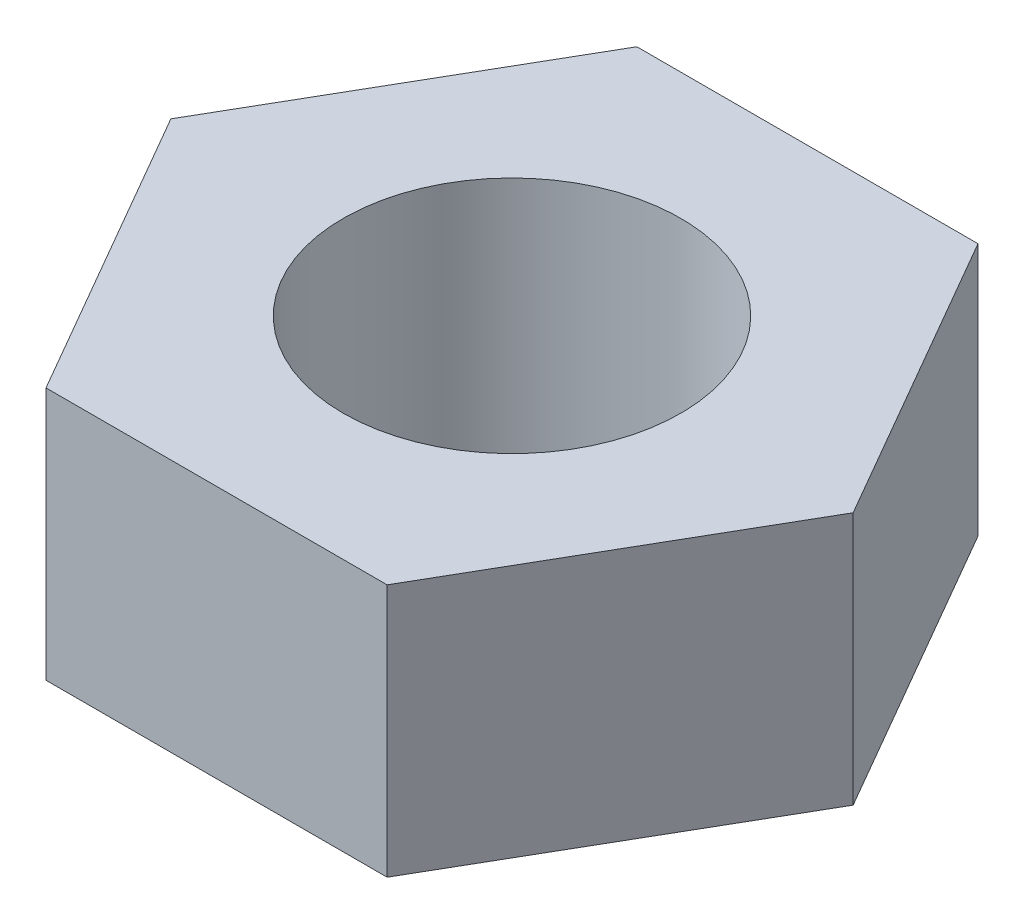
ISO-10303-21;
HEADER;
FILE_DESCRIPTION(('STEP AP214'),'2;1');
FILE_NAME('part.step','',(''),(''),'','','');
FILE_SCHEMA(('AUTOMOTIVE_DESIGN { 1 0 10303 214 1 1 1 1 }'));
ENDSEC;
DATA;
#1=APPLICATION_CONTEXT('core data for automotive mechanical design processes');
#2=APPLICATION_PROTOCOL_DEFINITION('international standard','automotive_design',2000,#1);
#3=PRODUCT_CONTEXT('',#1,'mechanical');
#4=PRODUCT('Part','Part','',(#3));
#5=PRODUCT_RELATED_PRODUCT_CATEGORY('part','',(#4));
#6=PRODUCT_DEFINITION_FORMATION('','',#4);
#7=PRODUCT_DEFINITION_CONTEXT('part definition',#1,'design');
#8=PRODUCT_DEFINITION('design','',#6,#7);
#9=PRODUCT_DEFINITION_SHAPE('','',#8);
#10=(LENGTH_UNIT() NAMED_UNIT(*) SI_UNIT(.MILLI.,.METRE.));
#11=(NAMED_UNIT(*) PLANE_ANGLE_UNIT() SI_UNIT($,.RADIAN.));
#12=(NAMED_UNIT(*) SI_UNIT($,.STERADIAN.) SOLID_ANGLE_UNIT());
#13=UNCERTAINTY_MEASURE_WITH_UNIT(LENGTH_MEASURE(1.E-05),#10,'distance_accuracy_value','');
#14=(GEOMETRIC_REPRESENTATION_CONTEXT(3) GLOBAL_UNCERTAINTY_ASSIGNED_CONTEXT((#13)) GLOBAL_UNIT_ASSIGNED_CONTEXT((#10,
#11,#12)) REPRESENTATION_CONTEXT('',''));
#15=CARTESIAN_POINT('',(0.,0.,0.));
#16=DIRECTION('',(0.,0.,1.));
#17=DIRECTION('',(1.,0.,0.));
#18=AXIS2_PLACEMENT_3D('',#15,#16,#17);
#19=CARTESIAN_POINT('',(2.02072594216369,3.,3.5));
#20=DIRECTION('',(0.,1.,0.));
#21=DIRECTION('',(0.,0.,1.));
#22=AXIS2_PLACEMENT_3D('',#19,#20,#21);
#23=PLANE('',#22);
#24=DIRECTION('',(1.,0.,0.));
#25=VECTOR('',#24,1.);
#26=CARTESIAN_POINT('',(-2.02072594216369,3.,3.5));
#27=LINE('',#26,#25);
#28=CARTESIAN_POINT('',(-2.02072594216369,3.,3.5));
#29=VERTEX_POINT('',#28);
#30=CARTESIAN_POINT('',(2.02072594216369,3.,3.5));
#31=VERTEX_POINT('',#30);
#32=EDGE_CURVE('E118',#29,#31,#27,.T.);
#33=ORIENTED_EDGE('',*,*,#32,.T.);
#34=DIRECTION('',(0.5,0.,-0.866025403784439));
#35=VECTOR('',#34,1.);
#36=CARTESIAN_POINT('',(2.02072594216369,3.,3.5));
#37=LINE('',#36,#35);
#38=CARTESIAN_POINT('',(4.04145188432738,3.,0.));
#39=VERTEX_POINT('',#38);
#40=EDGE_CURVE('E99',#31,#39,#37,.T.);
#41=ORIENTED_EDGE('',*,*,#40,.T.);
#42=DIRECTION('',(-0.5,0.,-0.866025403784439));
#43=VECTOR('',#42,1.);
#44=CARTESIAN_POINT('',(4.04145188432738,3.,0.));
#45=LINE('',#44,#43);
#46=CARTESIAN_POINT('',(2.02072594216369,3.,-3.5));
#47=VERTEX_POINT('',#46);
#48=EDGE_CURVE('E121',#39,#47,#45,.T.);
#49=ORIENTED_EDGE('',*,*,#48,.T.);
#50=DIRECTION('',(-1.,0.,0.));
#51=VECTOR('',#50,1.);
#52=CARTESIAN_POINT('',(2.02072594216369,3.,-3.5));
#53=LINE('',#52,#51);
#54=CARTESIAN_POINT('',(-2.02072594216369,3.,-3.5));
#55=VERTEX_POINT('',#54);
#56=EDGE_CURVE('E123',#47,#55,#53,.T.);
#57=ORIENTED_EDGE('',*,*,#56,.T.);
#58=DIRECTION('',(-0.5,0.,0.866025403784439));
#59=VECTOR('',#58,1.);
#60=CARTESIAN_POINT('',(-2.02072594216369,3.,-3.5));
#61=LINE('',#60,#59);
#62=CARTESIAN_POINT('',(-4.04145188432738,3.,0.));
#63=VERTEX_POINT('',#62);
#64=EDGE_CURVE('E52',#55,#63,#61,.T.);
#65=ORIENTED_EDGE('',*,*,#64,.T.);
#66=DIRECTION('',(0.5,0.,0.866025403784439));
#67=VECTOR('',#66,1.);
#68=CARTESIAN_POINT('',(-4.04145188432738,3.,0.));
#69=LINE('',#68,#67);
#70=EDGE_CURVE('E47',#63,#29,#69,.T.);
#71=ORIENTED_EDGE('',*,*,#70,.T.);
#72=EDGE_LOOP('',(#33,#41,#49,#57,#65,#71));
#73=FACE_BOUND('',#72,.T.);
#74=CARTESIAN_POINT('',(0.,3.,0.));
#75=DIRECTION('',(0.,1.,0.));
#76=DIRECTION('',(0.,0.,1.));
#77=AXIS2_PLACEMENT_3D('',#74,#75,#76);
#78=CIRCLE('',#77,2.);
#79=CARTESIAN_POINT('',(0.,3.,2.));
#80=VERTEX_POINT('',#79);
#81=EDGE_CURVE('E104',#80,#80,#78,.T.);
#82=ORIENTED_EDGE('',*,*,#81,.F.);
#83=EDGE_LOOP('',(#82));
#84=FACE_BOUND('',#83,.T.);
#85=ADVANCED_FACE('F32',(#73,#84),#23,.T.);
#86=CARTESIAN_POINT('',(2.02072594216369,0.,3.5));
#87=DIRECTION('',(0.,1.,0.));
#88=DIRECTION('',(0.,0.,1.));
#89=AXIS2_PLACEMENT_3D('',#86,#87,#88);
#90=PLANE('',#89);
#91=DIRECTION('',(1.,0.,0.));
#92=VECTOR('',#91,1.);
#93=CARTESIAN_POINT('',(-2.02072594216369,0.,3.5));
#94=LINE('',#93,#92);
#95=CARTESIAN_POINT('',(-2.02072594216369,0.,3.5));
#96=VERTEX_POINT('',#95);
#97=CARTESIAN_POINT('',(2.02072594216369,0.,3.5));
#98=VERTEX_POINT('',#97);
#99=EDGE_CURVE('E90',#96,#98,#94,.T.);
#100=ORIENTED_EDGE('',*,*,#99,.F.);
#101=DIRECTION('',(0.5,0.,0.866025403784439));
#102=VECTOR('',#101,1.);
#103=CARTESIAN_POINT('',(-4.04145188432738,0.,0.));
#104=LINE('',#103,#102);
#105=CARTESIAN_POINT('',(-4.04145188432738,0.,0.));
#106=VERTEX_POINT('',#105);
#107=EDGE_CURVE('E116',#106,#96,#104,.T.);
#108=ORIENTED_EDGE('',*,*,#107,.F.);
#109=DIRECTION('',(-0.5,0.,0.866025403784439));
#110=VECTOR('',#109,1.);
#111=CARTESIAN_POINT('',(-2.02072594216369,0.,-3.5));
#112=LINE('',#111,#110);
#113=CARTESIAN_POINT('',(-2.02072594216369,0.,-3.5));
#114=VERTEX_POINT('',#113);
#115=EDGE_CURVE('E114',#114,#106,#112,.T.);
#116=ORIENTED_EDGE('',*,*,#115,.F.);
#117=DIRECTION('',(-1.,0.,0.));
#118=VECTOR('',#117,1.);
#119=CARTESIAN_POINT('',(2.02072594216369,0.,-3.5));
#120=LINE('',#119,#118);
#121=CARTESIAN_POINT('',(2.02072594216369,0.,-3.5));
#122=VERTEX_POINT('',#121);
#123=EDGE_CURVE('E112',#122,#114,#120,.T.);
#124=ORIENTED_EDGE('',*,*,#123,.F.);
#125=DIRECTION('',(-0.5,0.,-0.866025403784439));
#126=VECTOR('',#125,1.);
#127=CARTESIAN_POINT('',(4.04145188432738,0.,0.));
#128=LINE('',#127,#126);
#129=CARTESIAN_POINT('',(4.04145188432738,0.,0.));
#130=VERTEX_POINT('',#129);
#131=EDGE_CURVE('E92',#130,#122,#128,.T.);
#132=ORIENTED_EDGE('',*,*,#131,.F.);
#133=DIRECTION('',(0.5,0.,-0.866025403784439));
#134=VECTOR('',#133,1.);
#135=CARTESIAN_POINT('',(2.02072594216369,0.,3.5));
#136=LINE('',#135,#134);
#137=EDGE_CURVE('E85',#98,#130,#136,.T.);
#138=ORIENTED_EDGE('',*,*,#137,.F.);
#139=EDGE_LOOP('',(#100,#108,#116,#124,#132,#138));
#140=FACE_BOUND('',#139,.T.);
#141=CARTESIAN_POINT('',(0.,0.,0.));
#142=DIRECTION('',(0.,1.,0.));
#143=DIRECTION('',(0.,0.,1.));
#144=AXIS2_PLACEMENT_3D('',#141,#142,#143);
#145=CIRCLE('',#144,2.);
#146=CARTESIAN_POINT('',(0.,0.,2.));
#147=VERTEX_POINT('',#146);
#148=EDGE_CURVE('E107',#147,#147,#145,.T.);
#149=ORIENTED_EDGE('',*,*,#148,.T.);
#150=EDGE_LOOP('',(#149));
#151=FACE_BOUND('',#150,.T.);
#152=ADVANCED_FACE('F86',(#140,#151),#90,.F.);
#153=CARTESIAN_POINT('',(-2.02072594216369,3.,3.5));
#154=DIRECTION('',(0.,0.,-1.));
#155=DIRECTION('',(-1.,0.,0.));
#156=AXIS2_PLACEMENT_3D('',#153,#154,#155);
#157=PLANE('',#156);
#158=ORIENTED_EDGE('',*,*,#99,.T.);
#159=DIRECTION('',(0.,-1.,0.));
#160=VECTOR('',#159,1.);
#161=CARTESIAN_POINT('',(2.02072594216369,3.,3.5));
#162=LINE('',#161,#160);
#163=EDGE_CURVE('E11',#31,#98,#162,.T.);
#164=ORIENTED_EDGE('',*,*,#163,.F.);
#165=ORIENTED_EDGE('',*,*,#32,.F.);
#166=DIRECTION('',(0.,-1.,0.));
#167=VECTOR('',#166,1.);
#168=CARTESIAN_POINT('',(-2.02072594216369,3.,3.5));
#169=LINE('',#168,#167);
#170=EDGE_CURVE('E103',#29,#96,#169,.T.);
#171=ORIENTED_EDGE('',*,*,#170,.T.);
#172=EDGE_LOOP('',(#158,#164,#165,#171));
#173=FACE_BOUND('',#172,.T.);
#174=ADVANCED_FACE('F34',(#173),#157,.F.);
#175=CARTESIAN_POINT('',(2.02072594216369,3.,3.5));
#176=DIRECTION('',(-0.866025403784439,0.,-0.5));
#177=DIRECTION('',(-0.5,0.,0.866025403784439));
#178=AXIS2_PLACEMENT_3D('',#175,#176,#177);
#179=PLANE('',#178);
#180=ORIENTED_EDGE('',*,*,#137,.T.);
#181=DIRECTION('',(0.,-1.,0.));
#182=VECTOR('',#181,1.);
#183=CARTESIAN_POINT('',(4.04145188432738,3.,0.));
#184=LINE('',#183,#182);
#185=EDGE_CURVE('E40',#39,#130,#184,.T.);
#186=ORIENTED_EDGE('',*,*,#185,.F.);
#187=ORIENTED_EDGE('',*,*,#40,.F.);
#188=ORIENTED_EDGE('',*,*,#163,.T.);
#189=EDGE_LOOP('',(#180,#186,#187,#188));
#190=FACE_BOUND('',#189,.T.);
#191=ADVANCED_FACE('F98',(#190),#179,.F.);
#192=CARTESIAN_POINT('',(4.04145188432738,3.,0.));
#193=DIRECTION('',(-0.866025403784438,0.,0.5));
#194=DIRECTION('',(0.5,0.,0.866025403784439));
#195=AXIS2_PLACEMENT_3D('',#192,#193,#194);
#196=PLANE('',#195);
#197=ORIENTED_EDGE('',*,*,#131,.T.);
#198=DIRECTION('',(0.,-1.,0.));
#199=VECTOR('',#198,1.);
#200=CARTESIAN_POINT('',(2.02072594216369,3.,-3.5));
#201=LINE('',#200,#199);
#202=EDGE_CURVE('E134',#47,#122,#201,.T.);
#203=ORIENTED_EDGE('',*,*,#202,.F.);
#204=ORIENTED_EDGE('',*,*,#48,.F.);
#205=ORIENTED_EDGE('',*,*,#185,.T.);
#206=EDGE_LOOP('',(#197,#203,#204,#205));
#207=FACE_BOUND('',#206,.T.);
#208=ADVANCED_FACE('F138',(#207),#196,.F.);
#209=CARTESIAN_POINT('',(2.02072594216369,3.,-3.5));
#210=DIRECTION('',(0.,0.,1.));
#211=DIRECTION('',(1.,0.,0.));
#212=AXIS2_PLACEMENT_3D('',#209,#210,#211);
#213=PLANE('',#212);
#214=ORIENTED_EDGE('',*,*,#123,.T.);
#215=DIRECTION('',(0.,-1.,0.));
#216=VECTOR('',#215,1.);
#217=CARTESIAN_POINT('',(-2.02072594216369,3.,-3.5));
#218=LINE('',#217,#216);
#219=EDGE_CURVE('E131',#55,#114,#218,.T.);
#220=ORIENTED_EDGE('',*,*,#219,.F.);
#221=ORIENTED_EDGE('',*,*,#56,.F.);
#222=ORIENTED_EDGE('',*,*,#202,.T.);
#223=EDGE_LOOP('',(#214,#220,#221,#222));
#224=FACE_BOUND('',#223,.T.);
#225=ADVANCED_FACE('F144',(#224),#213,.F.);
#226=CARTESIAN_POINT('',(-2.02072594216369,3.,-3.5));
#227=DIRECTION('',(0.866025403784439,0.,0.5));
#228=DIRECTION('',(0.5,0.,-0.866025403784439));
#229=AXIS2_PLACEMENT_3D('',#226,#227,#228);
#230=PLANE('',#229);
#231=ORIENTED_EDGE('',*,*,#115,.T.);
#232=DIRECTION('',(0.,-1.,0.));
#233=VECTOR('',#232,1.);
#234=CARTESIAN_POINT('',(-4.04145188432738,3.,0.));
#235=LINE('',#234,#233);
#236=EDGE_CURVE('E128',#63,#106,#235,.T.);
#237=ORIENTED_EDGE('',*,*,#236,.F.);
#238=ORIENTED_EDGE('',*,*,#64,.F.);
#239=ORIENTED_EDGE('',*,*,#219,.T.);
#240=EDGE_LOOP('',(#231,#237,#238,#239));
#241=FACE_BOUND('',#240,.T.);
#242=ADVANCED_FACE('F147',(#241),#230,.F.);
#243=CARTESIAN_POINT('',(-4.04145188432738,3.,0.));
#244=DIRECTION('',(0.866025403784438,0.,-0.5));
#245=DIRECTION('',(-0.5,0.,-0.866025403784439));
#246=AXIS2_PLACEMENT_3D('',#243,#244,#245);
#247=PLANE('',#246);
#248=ORIENTED_EDGE('',*,*,#107,.T.);
#249=ORIENTED_EDGE('',*,*,#170,.F.);
#250=ORIENTED_EDGE('',*,*,#70,.F.);
#251=ORIENTED_EDGE('',*,*,#236,.T.);
#252=EDGE_LOOP('',(#248,#249,#250,#251));
#253=FACE_BOUND('',#252,.T.);
#254=ADVANCED_FACE('F149',(#253),#247,.F.);
#255=CARTESIAN_POINT('',(0.,3.,0.));
#256=DIRECTION('',(0.,-1.,0.));
#257=DIRECTION('',(0.,0.,-1.));
#258=AXIS2_PLACEMENT_3D('',#255,#256,#257);
#259=CYLINDRICAL_SURFACE('',#258,2.);
#260=ORIENTED_EDGE('',*,*,#81,.T.);
#261=EDGE_LOOP('',(#260));
#262=FACE_BOUND('',#261,.T.);
#263=ORIENTED_EDGE('',*,*,#148,.F.);
#264=EDGE_LOOP('',(#263));
#265=FACE_BOUND('',#264,.T.);
#266=ADVANCED_FACE('F151',(#262,#265),#259,.F.);
#267=CLOSED_SHELL('',(#85,#152,#174,#191,#208,#225,#242,#254,#266));
#268=MANIFOLD_SOLID_BREP('B2',#267);
#269=ADVANCED_BREP_SHAPE_REPRESENTATION('',(#18,#268),#14);
#270=SHAPE_DEFINITION_REPRESENTATION(#9,#269);
ENDSEC;
END-ISO-10303-21;
